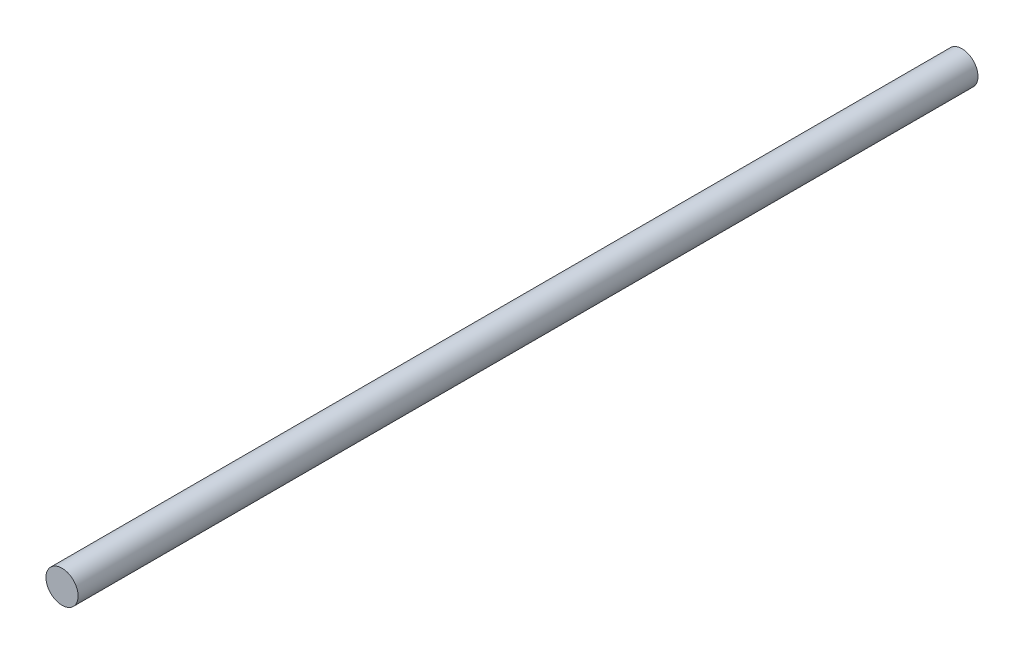
ISO-10303-21;
HEADER;
FILE_DESCRIPTION(('STEP AP214'),'2;1');
FILE_NAME('part.step','',(''),(''),'','','');
FILE_SCHEMA(('AUTOMOTIVE_DESIGN { 1 0 10303 214 1 1 1 1 }'));
ENDSEC;
DATA;
#1=APPLICATION_CONTEXT('core data for automotive mechanical design processes');
#2=APPLICATION_PROTOCOL_DEFINITION('international standard','automotive_design',2000,#1);
#3=PRODUCT_CONTEXT('',#1,'mechanical');
#4=PRODUCT('Part','Part','',(#3));
#5=PRODUCT_RELATED_PRODUCT_CATEGORY('part','',(#4));
#6=PRODUCT_DEFINITION_FORMATION('','',#4);
#7=PRODUCT_DEFINITION_CONTEXT('part definition',#1,'design');
#8=PRODUCT_DEFINITION('design','',#6,#7);
#9=PRODUCT_DEFINITION_SHAPE('','',#8);
#10=(LENGTH_UNIT() NAMED_UNIT(*) SI_UNIT(.MILLI.,.METRE.));
#11=(NAMED_UNIT(*) PLANE_ANGLE_UNIT() SI_UNIT($,.RADIAN.));
#12=(NAMED_UNIT(*) SI_UNIT($,.STERADIAN.) SOLID_ANGLE_UNIT());
#13=UNCERTAINTY_MEASURE_WITH_UNIT(LENGTH_MEASURE(1.E-05),#10,'distance_accuracy_value','');
#14=(GEOMETRIC_REPRESENTATION_CONTEXT(3) GLOBAL_UNCERTAINTY_ASSIGNED_CONTEXT((#13)) GLOBAL_UNIT_ASSIGNED_CONTEXT((#10,
#11,#12)) REPRESENTATION_CONTEXT('',''));
#15=CARTESIAN_POINT('',(0.,0.,0.));
#16=DIRECTION('',(0.,0.,1.));
#17=DIRECTION('',(1.,0.,0.));
#18=AXIS2_PLACEMENT_3D('',#15,#16,#17);
#19=CARTESIAN_POINT('',(0.,0.,100.));
#20=DIRECTION('',(0.,0.,-1.));
#21=DIRECTION('',(-1.,0.,0.));
#22=AXIS2_PLACEMENT_3D('',#19,#20,#21);
#23=CYLINDRICAL_SURFACE('',#22,1.5);
#24=CARTESIAN_POINT('',(0.,0.,0.));
#25=DIRECTION('',(0.,0.,1.));
#26=DIRECTION('',(1.,0.,0.));
#27=AXIS2_PLACEMENT_3D('',#24,#25,#26);
#28=CIRCLE('',#27,1.5);
#29=CARTESIAN_POINT('',(1.5,0.,0.));
#30=VERTEX_POINT('',#29);
#31=EDGE_CURVE('E10',#30,#30,#28,.T.);
#32=ORIENTED_EDGE('',*,*,#31,.T.);
#33=EDGE_LOOP('',(#32));
#34=FACE_BOUND('',#33,.T.);
#35=CARTESIAN_POINT('',(0.,0.,84.));
#36=DIRECTION('',(0.,0.,1.));
#37=DIRECTION('',(1.,0.,0.));
#38=AXIS2_PLACEMENT_3D('',#35,#36,#37);
#39=CIRCLE('',#38,1.5);
#40=CARTESIAN_POINT('',(1.5,0.,84.));
#41=VERTEX_POINT('',#40);
#42=EDGE_CURVE('E42',#41,#41,#39,.T.);
#43=ORIENTED_EDGE('',*,*,#42,.F.);
#44=EDGE_LOOP('',(#43));
#45=FACE_BOUND('',#44,.T.);
#46=ADVANCED_FACE('F36',(#34,#45),#23,.T.);
#47=CARTESIAN_POINT('',(0.,0.,0.));
#48=DIRECTION('',(0.,0.,1.));
#49=DIRECTION('',(1.,0.,0.));
#50=AXIS2_PLACEMENT_3D('',#47,#48,#49);
#51=PLANE('',#50);
#52=ORIENTED_EDGE('',*,*,#31,.F.);
#53=EDGE_LOOP('',(#52));
#54=FACE_BOUND('',#53,.T.);
#55=ADVANCED_FACE('F51',(#54),#51,.F.);
#56=CARTESIAN_POINT('',(0.,0.,84.));
#57=DIRECTION('',(0.,0.,1.));
#58=DIRECTION('',(1.,0.,0.));
#59=AXIS2_PLACEMENT_3D('',#56,#57,#58);
#60=PLANE('',#59);
#61=ORIENTED_EDGE('',*,*,#42,.T.);
#62=EDGE_LOOP('',(#61));
#63=FACE_BOUND('',#62,.T.);
#64=ADVANCED_FACE('F48',(#63),#60,.T.);
#65=CLOSED_SHELL('',(#46,#55,#64));
#66=MANIFOLD_SOLID_BREP('B2',#65);
#67=ADVANCED_BREP_SHAPE_REPRESENTATION('',(#18,#66),#14);
#68=SHAPE_DEFINITION_REPRESENTATION(#9,#67);
ENDSEC;
END-ISO-10303-21;
